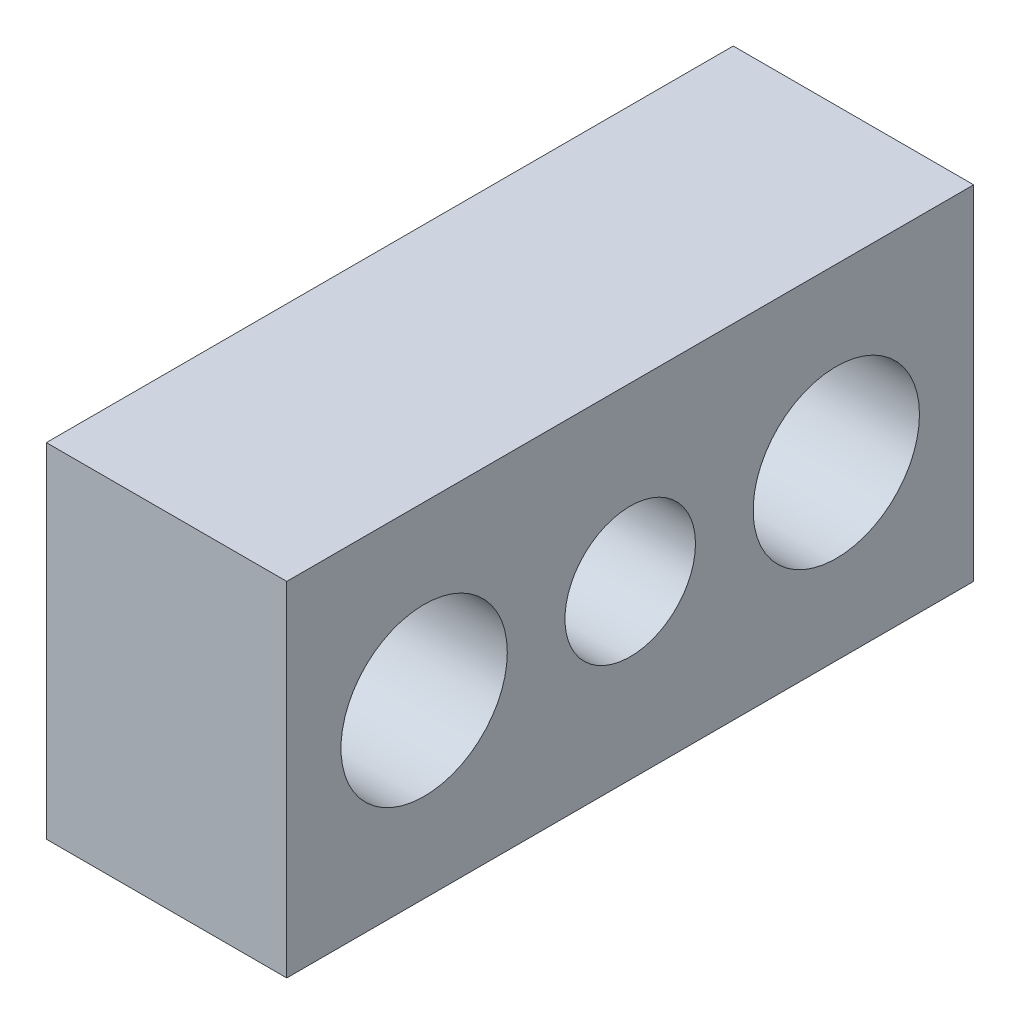
ISO-10303-21;
HEADER;
FILE_DESCRIPTION(('STEP AP214'),'2;1');
FILE_NAME('part.step','',(''),(''),'','','');
FILE_SCHEMA(('AUTOMOTIVE_DESIGN { 1 0 10303 214 1 1 1 1 }'));
ENDSEC;
DATA;
#1=APPLICATION_CONTEXT('core data for automotive mechanical design processes');
#2=APPLICATION_PROTOCOL_DEFINITION('international standard','automotive_design',2000,#1);
#3=PRODUCT_CONTEXT('',#1,'mechanical');
#4=PRODUCT('Part','Part','',(#3));
#5=PRODUCT_RELATED_PRODUCT_CATEGORY('part','',(#4));
#6=PRODUCT_DEFINITION_FORMATION('','',#4);
#7=PRODUCT_DEFINITION_CONTEXT('part definition',#1,'design');
#8=PRODUCT_DEFINITION('design','',#6,#7);
#9=PRODUCT_DEFINITION_SHAPE('','',#8);
#10=(LENGTH_UNIT() NAMED_UNIT(*) SI_UNIT(.MILLI.,.METRE.));
#11=(NAMED_UNIT(*) PLANE_ANGLE_UNIT() SI_UNIT($,.RADIAN.));
#12=(NAMED_UNIT(*) SI_UNIT($,.STERADIAN.) SOLID_ANGLE_UNIT());
#13=UNCERTAINTY_MEASURE_WITH_UNIT(LENGTH_MEASURE(1.E-05),#10,'distance_accuracy_value','');
#14=(GEOMETRIC_REPRESENTATION_CONTEXT(3) GLOBAL_UNCERTAINTY_ASSIGNED_CONTEXT((#13)) GLOBAL_UNIT_ASSIGNED_CONTEXT((#10,
#11,#12)) REPRESENTATION_CONTEXT('',''));
#15=CARTESIAN_POINT('',(0.,0.,0.));
#16=DIRECTION('',(0.,0.,1.));
#17=DIRECTION('',(1.,0.,0.));
#18=AXIS2_PLACEMENT_3D('',#15,#16,#17);
#19=CARTESIAN_POINT('',(7.,0.,0.));
#20=DIRECTION('',(-1.,0.,0.));
#21=DIRECTION('',(0.,0.,1.));
#22=AXIS2_PLACEMENT_3D('',#19,#20,#21);
#23=PLANE('',#22);
#24=DIRECTION('',(0.,-1.,0.));
#25=VECTOR('',#24,1.);
#26=CARTESIAN_POINT('',(7.,0.,0.));
#27=LINE('',#26,#25);
#28=CARTESIAN_POINT('',(7.,10.,0.));
#29=VERTEX_POINT('',#28);
#30=CARTESIAN_POINT('',(7.,0.,0.));
#31=VERTEX_POINT('',#30);
#32=EDGE_CURVE('E98',#29,#31,#27,.T.);
#33=ORIENTED_EDGE('',*,*,#32,.T.);
#34=DIRECTION('',(0.,0.,-1.));
#35=VECTOR('',#34,1.);
#36=CARTESIAN_POINT('',(7.,0.,0.));
#37=LINE('',#36,#35);
#38=CARTESIAN_POINT('',(7.,0.,-20.));
#39=VERTEX_POINT('',#38);
#40=EDGE_CURVE('E93',#31,#39,#37,.T.);
#41=ORIENTED_EDGE('',*,*,#40,.T.);
#42=DIRECTION('',(0.,1.,0.));
#43=VECTOR('',#42,1.);
#44=CARTESIAN_POINT('',(7.,0.,-20.));
#45=LINE('',#44,#43);
#46=CARTESIAN_POINT('',(7.,10.,-20.));
#47=VERTEX_POINT('',#46);
#48=EDGE_CURVE('E96',#39,#47,#45,.T.);
#49=ORIENTED_EDGE('',*,*,#48,.T.);
#50=DIRECTION('',(0.,0.,1.));
#51=VECTOR('',#50,1.);
#52=CARTESIAN_POINT('',(7.,10.,0.));
#53=LINE('',#52,#51);
#54=EDGE_CURVE('E63',#47,#29,#53,.T.);
#55=ORIENTED_EDGE('',*,*,#54,.T.);
#56=EDGE_LOOP('',(#33,#41,#49,#55));
#57=FACE_BOUND('',#56,.T.);
#58=CARTESIAN_POINT('',(7.,5.,-10.));
#59=DIRECTION('',(1.,0.,0.));
#60=DIRECTION('',(0.,0.,-1.));
#61=AXIS2_PLACEMENT_3D('',#58,#59,#60);
#62=CIRCLE('',#61,1.9);
#63=CARTESIAN_POINT('',(7.,5.,-11.9));
#64=VERTEX_POINT('',#63);
#65=EDGE_CURVE('E118',#64,#64,#62,.T.);
#66=ORIENTED_EDGE('',*,*,#65,.F.);
#67=EDGE_LOOP('',(#66));
#68=FACE_BOUND('',#67,.T.);
#69=CARTESIAN_POINT('',(7.,5.,-16.));
#70=DIRECTION('',(1.,0.,0.));
#71=DIRECTION('',(0.,0.,-1.));
#72=AXIS2_PLACEMENT_3D('',#69,#70,#71);
#73=CIRCLE('',#72,2.42152466367713);
#74=CARTESIAN_POINT('',(7.,5.,-18.4215246636771));
#75=VERTEX_POINT('',#74);
#76=EDGE_CURVE('E140',#75,#75,#73,.T.);
#77=ORIENTED_EDGE('',*,*,#76,.F.);
#78=EDGE_LOOP('',(#77));
#79=FACE_BOUND('',#78,.T.);
#80=CARTESIAN_POINT('',(7.,5.,-4.));
#81=DIRECTION('',(1.,0.,0.));
#82=DIRECTION('',(0.,0.,-1.));
#83=AXIS2_PLACEMENT_3D('',#80,#81,#82);
#84=CIRCLE('',#83,2.42152466367714);
#85=CARTESIAN_POINT('',(7.,5.,-6.42152466367714));
#86=VERTEX_POINT('',#85);
#87=EDGE_CURVE('E148',#86,#86,#84,.T.);
#88=ORIENTED_EDGE('',*,*,#87,.F.);
#89=EDGE_LOOP('',(#88));
#90=FACE_BOUND('',#89,.T.);
#91=ADVANCED_FACE('F45',(#57,#68,#79,#90),#23,.F.);
#92=CARTESIAN_POINT('',(0.,0.,0.));
#93=DIRECTION('',(-1.,0.,0.));
#94=DIRECTION('',(0.,0.,1.));
#95=AXIS2_PLACEMENT_3D('',#92,#93,#94);
#96=PLANE('',#95);
#97=CARTESIAN_POINT('',(0.,5.,-16.));
#98=DIRECTION('',(1.,0.,0.));
#99=DIRECTION('',(0.,0.,-1.));
#100=AXIS2_PLACEMENT_3D('',#97,#98,#99);
#101=CIRCLE('',#100,2.42152466367713);
#102=CARTESIAN_POINT('',(0.,5.,-18.4215246636771));
#103=VERTEX_POINT('',#102);
#104=EDGE_CURVE('E144',#103,#103,#101,.T.);
#105=ORIENTED_EDGE('',*,*,#104,.T.);
#106=EDGE_LOOP('',(#105));
#107=FACE_BOUND('',#106,.T.);
#108=DIRECTION('',(0.,-1.,0.));
#109=VECTOR('',#108,1.);
#110=CARTESIAN_POINT('',(0.,0.,0.));
#111=LINE('',#110,#109);
#112=CARTESIAN_POINT('',(0.,10.,0.));
#113=VERTEX_POINT('',#112);
#114=CARTESIAN_POINT('',(0.,0.,0.));
#115=VERTEX_POINT('',#114);
#116=EDGE_CURVE('E114',#113,#115,#111,.T.);
#117=ORIENTED_EDGE('',*,*,#116,.F.);
#118=DIRECTION('',(0.,0.,1.));
#119=VECTOR('',#118,1.);
#120=CARTESIAN_POINT('',(0.,10.,0.));
#121=LINE('',#120,#119);
#122=CARTESIAN_POINT('',(0.,10.,-20.));
#123=VERTEX_POINT('',#122);
#124=EDGE_CURVE('E86',#123,#113,#121,.T.);
#125=ORIENTED_EDGE('',*,*,#124,.F.);
#126=DIRECTION('',(0.,1.,0.));
#127=VECTOR('',#126,1.);
#128=CARTESIAN_POINT('',(0.,0.,-20.));
#129=LINE('',#128,#127);
#130=CARTESIAN_POINT('',(0.,0.,-20.));
#131=VERTEX_POINT('',#130);
#132=EDGE_CURVE('E80',#131,#123,#129,.T.);
#133=ORIENTED_EDGE('',*,*,#132,.F.);
#134=DIRECTION('',(0.,0.,-1.));
#135=VECTOR('',#134,1.);
#136=CARTESIAN_POINT('',(0.,0.,0.));
#137=LINE('',#136,#135);
#138=EDGE_CURVE('E103',#115,#131,#137,.T.);
#139=ORIENTED_EDGE('',*,*,#138,.F.);
#140=EDGE_LOOP('',(#117,#125,#133,#139));
#141=FACE_BOUND('',#140,.T.);
#142=CARTESIAN_POINT('',(0.,5.,-10.));
#143=DIRECTION('',(1.,0.,0.));
#144=DIRECTION('',(0.,0.,-1.));
#145=AXIS2_PLACEMENT_3D('',#142,#143,#144);
#146=CIRCLE('',#145,1.9);
#147=CARTESIAN_POINT('',(0.,5.,-11.9));
#148=VERTEX_POINT('',#147);
#149=EDGE_CURVE('E136',#148,#148,#146,.T.);
#150=ORIENTED_EDGE('',*,*,#149,.T.);
#151=EDGE_LOOP('',(#150));
#152=FACE_BOUND('',#151,.T.);
#153=CARTESIAN_POINT('',(0.,5.,-4.));
#154=DIRECTION('',(1.,0.,0.));
#155=DIRECTION('',(0.,0.,-1.));
#156=AXIS2_PLACEMENT_3D('',#153,#154,#155);
#157=CIRCLE('',#156,2.42152466367714);
#158=CARTESIAN_POINT('',(0.,5.,-6.42152466367714));
#159=VERTEX_POINT('',#158);
#160=EDGE_CURVE('E152',#159,#159,#157,.T.);
#161=ORIENTED_EDGE('',*,*,#160,.T.);
#162=EDGE_LOOP('',(#161));
#163=FACE_BOUND('',#162,.T.);
#164=ADVANCED_FACE('F131',(#107,#141,#152,#163),#96,.T.);
#165=CARTESIAN_POINT('',(7.,0.,0.));
#166=DIRECTION('',(0.,0.,-1.));
#167=DIRECTION('',(0.,1.,0.));
#168=AXIS2_PLACEMENT_3D('',#165,#166,#167);
#169=PLANE('',#168);
#170=ORIENTED_EDGE('',*,*,#116,.T.);
#171=DIRECTION('',(-1.,0.,0.));
#172=VECTOR('',#171,1.);
#173=CARTESIAN_POINT('',(7.,0.,0.));
#174=LINE('',#173,#172);
#175=EDGE_CURVE('E11',#31,#115,#174,.T.);
#176=ORIENTED_EDGE('',*,*,#175,.F.);
#177=ORIENTED_EDGE('',*,*,#32,.F.);
#178=DIRECTION('',(-1.,0.,0.));
#179=VECTOR('',#178,1.);
#180=CARTESIAN_POINT('',(7.,10.,0.));
#181=LINE('',#180,#179);
#182=EDGE_CURVE('E110',#29,#113,#181,.T.);
#183=ORIENTED_EDGE('',*,*,#182,.T.);
#184=EDGE_LOOP('',(#170,#176,#177,#183));
#185=FACE_BOUND('',#184,.T.);
#186=ADVANCED_FACE('F47',(#185),#169,.F.);
#187=CARTESIAN_POINT('',(7.,0.,0.));
#188=DIRECTION('',(0.,1.,0.));
#189=DIRECTION('',(0.,0.,1.));
#190=AXIS2_PLACEMENT_3D('',#187,#188,#189);
#191=PLANE('',#190);
#192=ORIENTED_EDGE('',*,*,#138,.T.);
#193=DIRECTION('',(-1.,0.,0.));
#194=VECTOR('',#193,1.);
#195=CARTESIAN_POINT('',(7.,0.,-20.));
#196=LINE('',#195,#194);
#197=EDGE_CURVE('E55',#39,#131,#196,.T.);
#198=ORIENTED_EDGE('',*,*,#197,.F.);
#199=ORIENTED_EDGE('',*,*,#40,.F.);
#200=ORIENTED_EDGE('',*,*,#175,.T.);
#201=EDGE_LOOP('',(#192,#198,#199,#200));
#202=FACE_BOUND('',#201,.T.);
#203=ADVANCED_FACE('F102',(#202),#191,.F.);
#204=CARTESIAN_POINT('',(7.,0.,-20.));
#205=DIRECTION('',(0.,0.,1.));
#206=DIRECTION('',(0.,-1.,0.));
#207=AXIS2_PLACEMENT_3D('',#204,#205,#206);
#208=PLANE('',#207);
#209=ORIENTED_EDGE('',*,*,#132,.T.);
#210=DIRECTION('',(-1.,0.,0.));
#211=VECTOR('',#210,1.);
#212=CARTESIAN_POINT('',(7.,10.,-20.));
#213=LINE('',#212,#211);
#214=EDGE_CURVE('E105',#47,#123,#213,.T.);
#215=ORIENTED_EDGE('',*,*,#214,.F.);
#216=ORIENTED_EDGE('',*,*,#48,.F.);
#217=ORIENTED_EDGE('',*,*,#197,.T.);
#218=EDGE_LOOP('',(#209,#215,#216,#217));
#219=FACE_BOUND('',#218,.T.);
#220=ADVANCED_FACE('F106',(#219),#208,.F.);
#221=CARTESIAN_POINT('',(7.,10.,0.));
#222=DIRECTION('',(0.,-1.,0.));
#223=DIRECTION('',(0.,0.,-1.));
#224=AXIS2_PLACEMENT_3D('',#221,#222,#223);
#225=PLANE('',#224);
#226=ORIENTED_EDGE('',*,*,#124,.T.);
#227=ORIENTED_EDGE('',*,*,#182,.F.);
#228=ORIENTED_EDGE('',*,*,#54,.F.);
#229=ORIENTED_EDGE('',*,*,#214,.T.);
#230=EDGE_LOOP('',(#226,#227,#228,#229));
#231=FACE_BOUND('',#230,.T.);
#232=ADVANCED_FACE('F128',(#231),#225,.F.);
#233=CARTESIAN_POINT('',(7.,5.,-10.));
#234=DIRECTION('',(-1.,0.,0.));
#235=DIRECTION('',(0.,0.,1.));
#236=AXIS2_PLACEMENT_3D('',#233,#234,#235);
#237=CYLINDRICAL_SURFACE('',#236,1.9);
#238=ORIENTED_EDGE('',*,*,#65,.T.);
#239=EDGE_LOOP('',(#238));
#240=FACE_BOUND('',#239,.T.);
#241=ORIENTED_EDGE('',*,*,#149,.F.);
#242=EDGE_LOOP('',(#241));
#243=FACE_BOUND('',#242,.T.);
#244=ADVANCED_FACE('F171',(#240,#243),#237,.F.);
#245=CARTESIAN_POINT('',(7.,5.,-16.));
#246=DIRECTION('',(-1.,0.,0.));
#247=DIRECTION('',(0.,0.,1.));
#248=AXIS2_PLACEMENT_3D('',#245,#246,#247);
#249=CYLINDRICAL_SURFACE('',#248,2.42152466367713);
#250=ORIENTED_EDGE('',*,*,#76,.T.);
#251=EDGE_LOOP('',(#250));
#252=FACE_BOUND('',#251,.T.);
#253=ORIENTED_EDGE('',*,*,#104,.F.);
#254=EDGE_LOOP('',(#253));
#255=FACE_BOUND('',#254,.T.);
#256=ADVANCED_FACE('F216',(#252,#255),#249,.F.);
#257=CARTESIAN_POINT('',(7.,5.,-4.));
#258=DIRECTION('',(-1.,0.,0.));
#259=DIRECTION('',(0.,0.,1.));
#260=AXIS2_PLACEMENT_3D('',#257,#258,#259);
#261=CYLINDRICAL_SURFACE('',#260,2.42152466367714);
#262=ORIENTED_EDGE('',*,*,#87,.T.);
#263=EDGE_LOOP('',(#262));
#264=FACE_BOUND('',#263,.T.);
#265=ORIENTED_EDGE('',*,*,#160,.F.);
#266=EDGE_LOOP('',(#265));
#267=FACE_BOUND('',#266,.T.);
#268=ADVANCED_FACE('F160',(#264,#267),#261,.F.);
#269=CLOSED_SHELL('',(#91,#164,#186,#203,#220,#232,#244,#256,#268));
#270=MANIFOLD_SOLID_BREP('B2',#269);
#271=ADVANCED_BREP_SHAPE_REPRESENTATION('',(#18,#270),#14);
#272=SHAPE_DEFINITION_REPRESENTATION(#9,#271);
ENDSEC;
END-ISO-10303-21;
